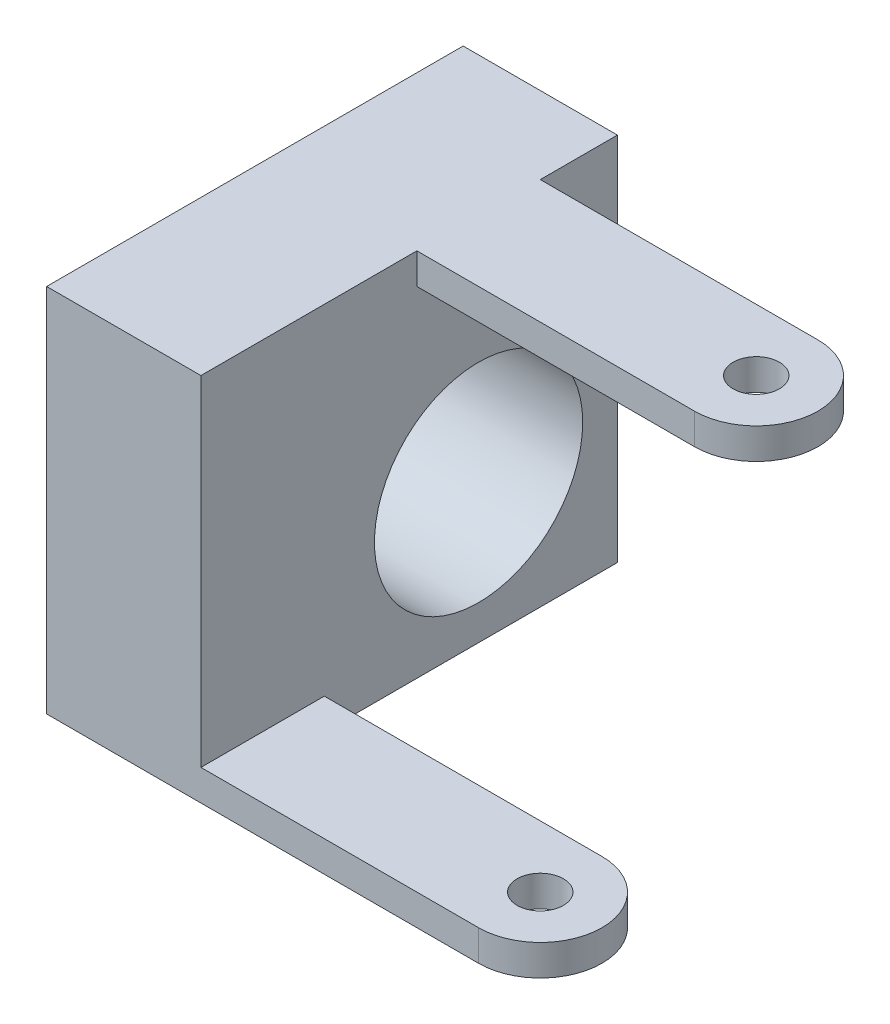
ISO-10303-21;
HEADER;
FILE_DESCRIPTION(('STEP AP214'),'2;1');
FILE_NAME('part.step','',(''),(''),'','','');
FILE_SCHEMA(('AUTOMOTIVE_DESIGN { 1 0 10303 214 1 1 1 1 }'));
ENDSEC;
DATA;
#1=APPLICATION_CONTEXT('core data for automotive mechanical design processes');
#2=APPLICATION_PROTOCOL_DEFINITION('international standard','automotive_design',2000,#1);
#3=PRODUCT_CONTEXT('',#1,'mechanical');
#4=PRODUCT('Part','Part','',(#3));
#5=PRODUCT_RELATED_PRODUCT_CATEGORY('part','',(#4));
#6=PRODUCT_DEFINITION_FORMATION('','',#4);
#7=PRODUCT_DEFINITION_CONTEXT('part definition',#1,'design');
#8=PRODUCT_DEFINITION('design','',#6,#7);
#9=PRODUCT_DEFINITION_SHAPE('','',#8);
#10=(LENGTH_UNIT() NAMED_UNIT(*) SI_UNIT(.MILLI.,.METRE.));
#11=(NAMED_UNIT(*) PLANE_ANGLE_UNIT() SI_UNIT($,.RADIAN.));
#12=(NAMED_UNIT(*) SI_UNIT($,.STERADIAN.) SOLID_ANGLE_UNIT());
#13=UNCERTAINTY_MEASURE_WITH_UNIT(LENGTH_MEASURE(1.E-05),#10,'distance_accuracy_value','');
#14=(GEOMETRIC_REPRESENTATION_CONTEXT(3) GLOBAL_UNCERTAINTY_ASSIGNED_CONTEXT((#13)) GLOBAL_UNIT_ASSIGNED_CONTEXT((#10,
#11,#12)) REPRESENTATION_CONTEXT('',''));
#15=CARTESIAN_POINT('',(0.,0.,0.));
#16=DIRECTION('',(0.,0.,1.));
#17=DIRECTION('',(1.,0.,0.));
#18=AXIS2_PLACEMENT_3D('',#15,#16,#17);
#19=CARTESIAN_POINT('',(23.,0.,14.));
#20=DIRECTION('',(0.,-1.,0.));
#21=DIRECTION('',(0.,0.,-1.));
#22=AXIS2_PLACEMENT_3D('',#19,#20,#21);
#23=CYLINDRICAL_SURFACE('',#22,4.);
#24=DIRECTION('',(0.,-1.,0.));
#25=VECTOR('',#24,1.);
#26=CARTESIAN_POINT('',(23.,24.,18.));
#27=LINE('',#26,#25);
#28=CARTESIAN_POINT('',(23.,0.,18.));
#29=VERTEX_POINT('',#28);
#30=CARTESIAN_POINT('',(23.,2.,18.));
#31=VERTEX_POINT('',#30);
#32=EDGE_CURVE('E261',#29,#31,#27,.F.);
#33=ORIENTED_EDGE('',*,*,#32,.F.);
#34=CARTESIAN_POINT('',(23.,0.,14.));
#35=DIRECTION('',(0.,-1.,0.));
#36=DIRECTION('',(0.,0.,-1.));
#37=AXIS2_PLACEMENT_3D('',#34,#35,#36);
#38=CIRCLE('',#37,4.);
#39=CARTESIAN_POINT('',(23.,0.,9.99999999999999));
#40=VERTEX_POINT('',#39);
#41=EDGE_CURVE('E56',#40,#29,#38,.T.);
#42=ORIENTED_EDGE('',*,*,#41,.F.);
#43=DIRECTION('',(0.,-1.,0.));
#44=VECTOR('',#43,1.);
#45=CARTESIAN_POINT('',(23.,0.,9.99999999999999));
#46=LINE('',#45,#44);
#47=CARTESIAN_POINT('',(23.,2.,9.99999999999999));
#48=VERTEX_POINT('',#47);
#49=EDGE_CURVE('E134',#48,#40,#46,.T.);
#50=ORIENTED_EDGE('',*,*,#49,.F.);
#51=CARTESIAN_POINT('',(23.,2.,14.));
#52=DIRECTION('',(0.,-1.,0.));
#53=DIRECTION('',(0.,0.,-1.));
#54=AXIS2_PLACEMENT_3D('',#51,#52,#53);
#55=CIRCLE('',#54,4.);
#56=EDGE_CURVE('E11',#31,#48,#55,.F.);
#57=ORIENTED_EDGE('',*,*,#56,.F.);
#58=EDGE_LOOP('',(#33,#42,#50,#57));
#59=FACE_BOUND('',#58,.T.);
#60=ADVANCED_FACE('F47',(#59),#23,.T.);
#61=CARTESIAN_POINT('',(5.,24.,18.));
#62=DIRECTION('',(-1.,0.,0.));
#63=DIRECTION('',(0.,0.,1.));
#64=AXIS2_PLACEMENT_3D('',#61,#62,#63);
#65=PLANE('',#64);
#66=CARTESIAN_POINT('',(5.,9.,0.));
#67=DIRECTION('',(1.,0.,0.));
#68=DIRECTION('',(0.,0.,-1.));
#69=AXIS2_PLACEMENT_3D('',#66,#67,#68);
#70=CIRCLE('',#69,6.75);
#71=CARTESIAN_POINT('',(5.,9.,-6.75));
#72=VERTEX_POINT('',#71);
#73=EDGE_CURVE('E203',#72,#72,#70,.T.);
#74=ORIENTED_EDGE('',*,*,#73,.F.);
#75=EDGE_LOOP('',(#74));
#76=FACE_BOUND('',#75,.T.);
#77=DIRECTION('',(0.,1.,0.));
#78=VECTOR('',#77,1.);
#79=CARTESIAN_POINT('',(5.,0.,10.));
#80=LINE('',#79,#78);
#81=CARTESIAN_POINT('',(5.,0.,10.));
#82=VERTEX_POINT('',#81);
#83=CARTESIAN_POINT('',(5.,2.,9.99999999999999));
#84=VERTEX_POINT('',#83);
#85=EDGE_CURVE('E133',#82,#84,#80,.T.);
#86=ORIENTED_EDGE('',*,*,#85,.F.);
#87=DIRECTION('',(0.,0.,-1.));
#88=VECTOR('',#87,1.);
#89=CARTESIAN_POINT('',(5.,0.,18.));
#90=LINE('',#89,#88);
#91=CARTESIAN_POINT('',(5.,0.,-9.));
#92=VERTEX_POINT('',#91);
#93=EDGE_CURVE('E141',#82,#92,#90,.T.);
#94=ORIENTED_EDGE('',*,*,#93,.T.);
#95=DIRECTION('',(0.,-1.,0.));
#96=VECTOR('',#95,1.);
#97=CARTESIAN_POINT('',(5.,24.,-9.));
#98=LINE('',#97,#96);
#99=CARTESIAN_POINT('',(5.,24.,-9.));
#100=VERTEX_POINT('',#99);
#101=EDGE_CURVE('E244',#100,#92,#98,.T.);
#102=ORIENTED_EDGE('',*,*,#101,.F.);
#103=DIRECTION('',(0.,0.,-1.));
#104=VECTOR('',#103,1.);
#105=CARTESIAN_POINT('',(5.,24.,18.));
#106=LINE('',#105,#104);
#107=CARTESIAN_POINT('',(5.,24.,-4.));
#108=VERTEX_POINT('',#107);
#109=EDGE_CURVE('E215',#108,#100,#106,.T.);
#110=ORIENTED_EDGE('',*,*,#109,.F.);
#111=DIRECTION('',(0.,1.,0.));
#112=VECTOR('',#111,1.);
#113=CARTESIAN_POINT('',(5.,24.,-4.));
#114=LINE('',#113,#112);
#115=CARTESIAN_POINT('',(5.,22.,-4.));
#116=VERTEX_POINT('',#115);
#117=EDGE_CURVE('E187',#116,#108,#114,.T.);
#118=ORIENTED_EDGE('',*,*,#117,.F.);
#119=DIRECTION('',(0.,0.,-1.));
#120=VECTOR('',#119,1.);
#121=CARTESIAN_POINT('',(5.,22.,4.));
#122=LINE('',#121,#120);
#123=CARTESIAN_POINT('',(5.,22.,4.));
#124=VERTEX_POINT('',#123);
#125=EDGE_CURVE('E183',#124,#116,#122,.T.);
#126=ORIENTED_EDGE('',*,*,#125,.F.);
#127=DIRECTION('',(0.,-1.,0.));
#128=VECTOR('',#127,1.);
#129=CARTESIAN_POINT('',(5.,24.,4.));
#130=LINE('',#129,#128);
#131=CARTESIAN_POINT('',(5.,24.,4.));
#132=VERTEX_POINT('',#131);
#133=EDGE_CURVE('E179',#132,#124,#130,.T.);
#134=ORIENTED_EDGE('',*,*,#133,.F.);
#135=CARTESIAN_POINT('',(5.,24.,18.));
#136=VERTEX_POINT('',#135);
#137=EDGE_CURVE('E210',#136,#132,#106,.T.);
#138=ORIENTED_EDGE('',*,*,#137,.F.);
#139=DIRECTION('',(0.,-1.,0.));
#140=VECTOR('',#139,1.);
#141=CARTESIAN_POINT('',(5.,24.,18.));
#142=LINE('',#141,#140);
#143=CARTESIAN_POINT('',(5.,2.,18.));
#144=VERTEX_POINT('',#143);
#145=EDGE_CURVE('E223',#136,#144,#142,.T.);
#146=ORIENTED_EDGE('',*,*,#145,.T.);
#147=DIRECTION('',(0.,0.,1.));
#148=VECTOR('',#147,1.);
#149=CARTESIAN_POINT('',(5.,2.,18.));
#150=LINE('',#149,#148);
#151=EDGE_CURVE('E155',#84,#144,#150,.T.);
#152=ORIENTED_EDGE('',*,*,#151,.F.);
#153=EDGE_LOOP('',(#86,#94,#102,#110,#118,#126,#134,#138,#146,#152));
#154=FACE_BOUND('',#153,.T.);
#155=ADVANCED_FACE('F152',(#76,#154),#65,.F.);
#156=CARTESIAN_POINT('',(23.,22.,0.));
#157=DIRECTION('',(0.,-1.,0.));
#158=DIRECTION('',(0.,0.,-1.));
#159=AXIS2_PLACEMENT_3D('',#156,#157,#158);
#160=CYLINDRICAL_SURFACE('',#159,4.);
#161=DIRECTION('',(0.,1.,0.));
#162=VECTOR('',#161,1.);
#163=CARTESIAN_POINT('',(23.,22.,4.));
#164=LINE('',#163,#162);
#165=CARTESIAN_POINT('',(23.,22.,4.));
#166=VERTEX_POINT('',#165);
#167=CARTESIAN_POINT('',(23.,24.,4.));
#168=VERTEX_POINT('',#167);
#169=EDGE_CURVE('E247',#166,#168,#164,.T.);
#170=ORIENTED_EDGE('',*,*,#169,.F.);
#171=CARTESIAN_POINT('',(23.,22.,0.));
#172=DIRECTION('',(0.,1.,0.));
#173=DIRECTION('',(0.,0.,1.));
#174=AXIS2_PLACEMENT_3D('',#171,#172,#173);
#175=CIRCLE('',#174,4.);
#176=CARTESIAN_POINT('',(23.,22.,-4.));
#177=VERTEX_POINT('',#176);
#178=EDGE_CURVE('E255',#177,#166,#175,.F.);
#179=ORIENTED_EDGE('',*,*,#178,.F.);
#180=DIRECTION('',(0.,1.,0.));
#181=VECTOR('',#180,1.);
#182=CARTESIAN_POINT('',(23.,22.,-4.));
#183=LINE('',#182,#181);
#184=CARTESIAN_POINT('',(23.,24.,-4.));
#185=VERTEX_POINT('',#184);
#186=EDGE_CURVE('E251',#185,#177,#183,.F.);
#187=ORIENTED_EDGE('',*,*,#186,.F.);
#188=CARTESIAN_POINT('',(23.,24.,0.));
#189=DIRECTION('',(0.,-1.,0.));
#190=DIRECTION('',(0.,0.,-1.));
#191=AXIS2_PLACEMENT_3D('',#188,#189,#190);
#192=CIRCLE('',#191,4.);
#193=EDGE_CURVE('E258',#168,#185,#192,.F.);
#194=ORIENTED_EDGE('',*,*,#193,.F.);
#195=EDGE_LOOP('',(#170,#179,#187,#194));
#196=FACE_BOUND('',#195,.T.);
#197=ADVANCED_FACE('F320',(#196),#160,.T.);
#198=CARTESIAN_POINT('',(-5.,24.,-9.));
#199=DIRECTION('',(0.,0.,1.));
#200=DIRECTION('',(1.,0.,0.));
#201=AXIS2_PLACEMENT_3D('',#198,#199,#200);
#202=PLANE('',#201);
#203=DIRECTION('',(-1.,0.,0.));
#204=VECTOR('',#203,1.);
#205=CARTESIAN_POINT('',(-5.,0.,-9.));
#206=LINE('',#205,#204);
#207=CARTESIAN_POINT('',(-5.,0.,-9.));
#208=VERTEX_POINT('',#207);
#209=EDGE_CURVE('E144',#92,#208,#206,.T.);
#210=ORIENTED_EDGE('',*,*,#209,.T.);
#211=DIRECTION('',(0.,-1.,0.));
#212=VECTOR('',#211,1.);
#213=CARTESIAN_POINT('',(-5.,24.,-9.));
#214=LINE('',#213,#212);
#215=CARTESIAN_POINT('',(-5.,24.,-9.));
#216=VERTEX_POINT('',#215);
#217=EDGE_CURVE('E240',#216,#208,#214,.T.);
#218=ORIENTED_EDGE('',*,*,#217,.F.);
#219=DIRECTION('',(-1.,0.,0.));
#220=VECTOR('',#219,1.);
#221=CARTESIAN_POINT('',(-5.,24.,-9.));
#222=LINE('',#221,#220);
#223=EDGE_CURVE('E214',#100,#216,#222,.T.);
#224=ORIENTED_EDGE('',*,*,#223,.F.);
#225=ORIENTED_EDGE('',*,*,#101,.T.);
#226=EDGE_LOOP('',(#210,#218,#224,#225));
#227=FACE_BOUND('',#226,.T.);
#228=ADVANCED_FACE('F279',(#227),#202,.F.);
#229=CARTESIAN_POINT('',(-4.99999999999999,24.,18.));
#230=DIRECTION('',(1.,0.,0.));
#231=DIRECTION('',(0.,0.,-1.));
#232=AXIS2_PLACEMENT_3D('',#229,#230,#231);
#233=PLANE('',#232);
#234=CARTESIAN_POINT('',(-5.,9.,0.));
#235=DIRECTION('',(1.,0.,0.));
#236=DIRECTION('',(0.,0.,-1.));
#237=AXIS2_PLACEMENT_3D('',#234,#235,#236);
#238=CIRCLE('',#237,6.75);
#239=CARTESIAN_POINT('',(-5.,9.,-6.75));
#240=VERTEX_POINT('',#239);
#241=EDGE_CURVE('E149',#240,#240,#238,.F.);
#242=ORIENTED_EDGE('',*,*,#241,.F.);
#243=EDGE_LOOP('',(#242));
#244=FACE_BOUND('',#243,.T.);
#245=DIRECTION('',(0.,0.,1.));
#246=VECTOR('',#245,1.);
#247=CARTESIAN_POINT('',(-4.99999999999999,0.,18.));
#248=LINE('',#247,#246);
#249=CARTESIAN_POINT('',(-4.99999999999999,0.,18.));
#250=VERTEX_POINT('',#249);
#251=EDGE_CURVE('E227',#208,#250,#248,.T.);
#252=ORIENTED_EDGE('',*,*,#251,.T.);
#253=DIRECTION('',(0.,-1.,0.));
#254=VECTOR('',#253,1.);
#255=CARTESIAN_POINT('',(-4.99999999999999,24.,18.));
#256=LINE('',#255,#254);
#257=CARTESIAN_POINT('',(-4.99999999999999,24.,18.));
#258=VERTEX_POINT('',#257);
#259=EDGE_CURVE('E236',#258,#250,#256,.T.);
#260=ORIENTED_EDGE('',*,*,#259,.F.);
#261=DIRECTION('',(0.,0.,1.));
#262=VECTOR('',#261,1.);
#263=CARTESIAN_POINT('',(-4.99999999999999,24.,18.));
#264=LINE('',#263,#262);
#265=EDGE_CURVE('E218',#216,#258,#264,.T.);
#266=ORIENTED_EDGE('',*,*,#265,.F.);
#267=ORIENTED_EDGE('',*,*,#217,.T.);
#268=EDGE_LOOP('',(#252,#260,#266,#267));
#269=FACE_BOUND('',#268,.T.);
#270=ADVANCED_FACE('F275',(#244,#269),#233,.F.);
#271=CARTESIAN_POINT('',(-4.99999999999999,24.,18.));
#272=DIRECTION('',(0.,0.,-1.));
#273=DIRECTION('',(-1.,0.,0.));
#274=AXIS2_PLACEMENT_3D('',#271,#272,#273);
#275=PLANE('',#274);
#276=DIRECTION('',(1.,0.,0.));
#277=VECTOR('',#276,1.);
#278=CARTESIAN_POINT('',(-4.99999999999999,0.,18.));
#279=LINE('',#278,#277);
#280=EDGE_CURVE('E230',#250,#29,#279,.T.);
#281=ORIENTED_EDGE('',*,*,#280,.T.);
#282=ORIENTED_EDGE('',*,*,#32,.T.);
#283=DIRECTION('',(-1.,0.,0.));
#284=VECTOR('',#283,1.);
#285=CARTESIAN_POINT('',(27.,2.,18.));
#286=LINE('',#285,#284);
#287=EDGE_CURVE('E161',#31,#144,#286,.T.);
#288=ORIENTED_EDGE('',*,*,#287,.T.);
#289=ORIENTED_EDGE('',*,*,#145,.F.);
#290=DIRECTION('',(1.,0.,0.));
#291=VECTOR('',#290,1.);
#292=CARTESIAN_POINT('',(-4.99999999999999,24.,18.));
#293=LINE('',#292,#291);
#294=EDGE_CURVE('E221',#258,#136,#293,.T.);
#295=ORIENTED_EDGE('',*,*,#294,.F.);
#296=ORIENTED_EDGE('',*,*,#259,.T.);
#297=EDGE_LOOP('',(#281,#282,#288,#289,#295,#296));
#298=FACE_BOUND('',#297,.T.);
#299=ADVANCED_FACE('F269',(#298),#275,.F.);
#300=CARTESIAN_POINT('',(0.,24.,0.));
#301=DIRECTION('',(0.,-1.,0.));
#302=DIRECTION('',(0.,0.,-1.));
#303=AXIS2_PLACEMENT_3D('',#300,#301,#302);
#304=PLANE('',#303);
#305=CARTESIAN_POINT('',(23.,24.,0.));
#306=DIRECTION('',(0.,1.,0.));
#307=DIRECTION('',(0.,0.,1.));
#308=AXIS2_PLACEMENT_3D('',#305,#306,#307);
#309=CIRCLE('',#308,1.5);
#310=CARTESIAN_POINT('',(23.,24.,1.5));
#311=VERTEX_POINT('',#310);
#312=EDGE_CURVE('E137',#311,#311,#309,.T.);
#313=ORIENTED_EDGE('',*,*,#312,.F.);
#314=EDGE_LOOP('',(#313));
#315=FACE_BOUND('',#314,.T.);
#316=DIRECTION('',(-1.,0.,0.));
#317=VECTOR('',#316,1.);
#318=CARTESIAN_POINT('',(27.,24.,4.));
#319=LINE('',#318,#317);
#320=EDGE_CURVE('E191',#168,#132,#319,.T.);
#321=ORIENTED_EDGE('',*,*,#320,.F.);
#322=ORIENTED_EDGE('',*,*,#193,.T.);
#323=DIRECTION('',(-1.,0.,0.));
#324=VECTOR('',#323,1.);
#325=CARTESIAN_POINT('',(27.,24.,-4.));
#326=LINE('',#325,#324);
#327=EDGE_CURVE('E194',#185,#108,#326,.T.);
#328=ORIENTED_EDGE('',*,*,#327,.T.);
#329=ORIENTED_EDGE('',*,*,#109,.T.);
#330=ORIENTED_EDGE('',*,*,#223,.T.);
#331=ORIENTED_EDGE('',*,*,#265,.T.);
#332=ORIENTED_EDGE('',*,*,#294,.T.);
#333=ORIENTED_EDGE('',*,*,#137,.T.);
#334=EDGE_LOOP('',(#321,#322,#328,#329,#330,#331,#332,#333));
#335=FACE_BOUND('',#334,.T.);
#336=ADVANCED_FACE('F299',(#315,#335),#304,.F.);
#337=CARTESIAN_POINT('',(0.,0.,0.));
#338=DIRECTION('',(0.,-1.,0.));
#339=DIRECTION('',(0.,0.,-1.));
#340=AXIS2_PLACEMENT_3D('',#337,#338,#339);
#341=PLANE('',#340);
#342=CARTESIAN_POINT('',(23.,0.,14.));
#343=DIRECTION('',(0.,-1.,0.));
#344=DIRECTION('',(0.,0.,-1.));
#345=AXIS2_PLACEMENT_3D('',#342,#343,#344);
#346=CIRCLE('',#345,1.5);
#347=CARTESIAN_POINT('',(23.,0.,12.5));
#348=VERTEX_POINT('',#347);
#349=EDGE_CURVE('E157',#348,#348,#346,.F.);
#350=ORIENTED_EDGE('',*,*,#349,.T.);
#351=EDGE_LOOP('',(#350));
#352=FACE_BOUND('',#351,.T.);
#353=DIRECTION('',(-1.,0.,0.));
#354=VECTOR('',#353,1.);
#355=CARTESIAN_POINT('',(27.,0.,9.99999999999999));
#356=LINE('',#355,#354);
#357=EDGE_CURVE('E128',#40,#82,#356,.T.);
#358=ORIENTED_EDGE('',*,*,#357,.F.);
#359=ORIENTED_EDGE('',*,*,#41,.T.);
#360=ORIENTED_EDGE('',*,*,#280,.F.);
#361=ORIENTED_EDGE('',*,*,#251,.F.);
#362=ORIENTED_EDGE('',*,*,#209,.F.);
#363=ORIENTED_EDGE('',*,*,#93,.F.);
#364=EDGE_LOOP('',(#358,#359,#360,#361,#362,#363));
#365=FACE_BOUND('',#364,.T.);
#366=ADVANCED_FACE('F142',(#352,#365),#341,.T.);
#367=CARTESIAN_POINT('',(-24.0918830920368,9.,0.));
#368=DIRECTION('',(1.,0.,0.));
#369=DIRECTION('',(0.,0.,-1.));
#370=AXIS2_PLACEMENT_3D('',#367,#368,#369);
#371=CYLINDRICAL_SURFACE('',#370,6.75);
#372=ORIENTED_EDGE('',*,*,#241,.T.);
#373=EDGE_LOOP('',(#372));
#374=FACE_BOUND('',#373,.T.);
#375=ORIENTED_EDGE('',*,*,#73,.T.);
#376=EDGE_LOOP('',(#375));
#377=FACE_BOUND('',#376,.T.);
#378=ADVANCED_FACE('F342',(#374,#377),#371,.F.);
#379=CARTESIAN_POINT('',(27.,24.,4.));
#380=DIRECTION('',(0.,0.,-1.));
#381=DIRECTION('',(0.,1.,0.));
#382=AXIS2_PLACEMENT_3D('',#379,#380,#381);
#383=PLANE('',#382);
#384=DIRECTION('',(-1.,0.,0.));
#385=VECTOR('',#384,1.);
#386=CARTESIAN_POINT('',(27.,22.,4.));
#387=LINE('',#386,#385);
#388=EDGE_CURVE('E200',#166,#124,#387,.T.);
#389=ORIENTED_EDGE('',*,*,#388,.F.);
#390=ORIENTED_EDGE('',*,*,#169,.T.);
#391=ORIENTED_EDGE('',*,*,#320,.T.);
#392=ORIENTED_EDGE('',*,*,#133,.T.);
#393=EDGE_LOOP('',(#389,#390,#391,#392));
#394=FACE_BOUND('',#393,.T.);
#395=ADVANCED_FACE('F297',(#394),#383,.F.);
#396=CARTESIAN_POINT('',(27.,22.,4.));
#397=DIRECTION('',(0.,1.,0.));
#398=DIRECTION('',(0.,0.,1.));
#399=AXIS2_PLACEMENT_3D('',#396,#397,#398);
#400=PLANE('',#399);
#401=CARTESIAN_POINT('',(23.,22.,0.));
#402=DIRECTION('',(0.,1.,0.));
#403=DIRECTION('',(0.,0.,1.));
#404=AXIS2_PLACEMENT_3D('',#401,#402,#403);
#405=CIRCLE('',#404,1.5);
#406=CARTESIAN_POINT('',(23.,22.,1.5));
#407=VERTEX_POINT('',#406);
#408=EDGE_CURVE('E175',#407,#407,#405,.F.);
#409=ORIENTED_EDGE('',*,*,#408,.F.);
#410=EDGE_LOOP('',(#409));
#411=FACE_BOUND('',#410,.T.);
#412=DIRECTION('',(-1.,0.,0.));
#413=VECTOR('',#412,1.);
#414=CARTESIAN_POINT('',(27.,22.,-4.));
#415=LINE('',#414,#413);
#416=EDGE_CURVE('E197',#177,#116,#415,.T.);
#417=ORIENTED_EDGE('',*,*,#416,.F.);
#418=ORIENTED_EDGE('',*,*,#178,.T.);
#419=ORIENTED_EDGE('',*,*,#388,.T.);
#420=ORIENTED_EDGE('',*,*,#125,.T.);
#421=EDGE_LOOP('',(#417,#418,#419,#420));
#422=FACE_BOUND('',#421,.T.);
#423=ADVANCED_FACE('F291',(#411,#422),#400,.F.);
#424=CARTESIAN_POINT('',(27.,24.,-4.));
#425=DIRECTION('',(0.,0.,1.));
#426=DIRECTION('',(0.,-1.,0.));
#427=AXIS2_PLACEMENT_3D('',#424,#425,#426);
#428=PLANE('',#427);
#429=ORIENTED_EDGE('',*,*,#327,.F.);
#430=ORIENTED_EDGE('',*,*,#186,.T.);
#431=ORIENTED_EDGE('',*,*,#416,.T.);
#432=ORIENTED_EDGE('',*,*,#117,.T.);
#433=EDGE_LOOP('',(#429,#430,#431,#432));
#434=FACE_BOUND('',#433,.T.);
#435=ADVANCED_FACE('F287',(#434),#428,.F.);
#436=CARTESIAN_POINT('',(23.,17.7573593128807,0.));
#437=DIRECTION('',(0.,1.,0.));
#438=DIRECTION('',(0.,0.,1.));
#439=AXIS2_PLACEMENT_3D('',#436,#437,#438);
#440=CYLINDRICAL_SURFACE('',#439,1.5);
#441=ORIENTED_EDGE('',*,*,#408,.T.);
#442=EDGE_LOOP('',(#441));
#443=FACE_BOUND('',#442,.T.);
#444=ORIENTED_EDGE('',*,*,#312,.T.);
#445=EDGE_LOOP('',(#444));
#446=FACE_BOUND('',#445,.T.);
#447=ADVANCED_FACE('F312',(#443,#446),#440,.F.);
#448=CARTESIAN_POINT('',(27.,0.,9.99999999999999));
#449=DIRECTION('',(0.,0.,1.));
#450=DIRECTION('',(1.,0.,0.));
#451=AXIS2_PLACEMENT_3D('',#448,#449,#450);
#452=PLANE('',#451);
#453=DIRECTION('',(-1.,0.,0.));
#454=VECTOR('',#453,1.);
#455=CARTESIAN_POINT('',(27.,2.,9.99999999999999));
#456=LINE('',#455,#454);
#457=EDGE_CURVE('E138',#48,#84,#456,.T.);
#458=ORIENTED_EDGE('',*,*,#457,.F.);
#459=ORIENTED_EDGE('',*,*,#49,.T.);
#460=ORIENTED_EDGE('',*,*,#357,.T.);
#461=ORIENTED_EDGE('',*,*,#85,.T.);
#462=EDGE_LOOP('',(#458,#459,#460,#461));
#463=FACE_BOUND('',#462,.T.);
#464=ADVANCED_FACE('F131',(#463),#452,.F.);
#465=CARTESIAN_POINT('',(27.,2.,18.));
#466=DIRECTION('',(0.,-1.,0.));
#467=DIRECTION('',(0.,0.,-1.));
#468=AXIS2_PLACEMENT_3D('',#465,#466,#467);
#469=PLANE('',#468);
#470=CARTESIAN_POINT('',(23.,2.,14.));
#471=DIRECTION('',(0.,1.,0.));
#472=DIRECTION('',(0.,0.,1.));
#473=AXIS2_PLACEMENT_3D('',#470,#471,#472);
#474=CIRCLE('',#473,1.5);
#475=CARTESIAN_POINT('',(23.,2.,15.5));
#476=VERTEX_POINT('',#475);
#477=EDGE_CURVE('E164',#476,#476,#474,.T.);
#478=ORIENTED_EDGE('',*,*,#477,.F.);
#479=EDGE_LOOP('',(#478));
#480=FACE_BOUND('',#479,.T.);
#481=ORIENTED_EDGE('',*,*,#287,.F.);
#482=ORIENTED_EDGE('',*,*,#56,.T.);
#483=ORIENTED_EDGE('',*,*,#457,.T.);
#484=ORIENTED_EDGE('',*,*,#151,.T.);
#485=EDGE_LOOP('',(#481,#482,#483,#484));
#486=FACE_BOUND('',#485,.T.);
#487=ADVANCED_FACE('F300',(#480,#486),#469,.F.);
#488=CARTESIAN_POINT('',(23.,-4.24264068711929,14.));
#489=DIRECTION('',(0.,1.,0.));
#490=DIRECTION('',(0.,0.,1.));
#491=AXIS2_PLACEMENT_3D('',#488,#489,#490);
#492=CYLINDRICAL_SURFACE('',#491,1.5);
#493=ORIENTED_EDGE('',*,*,#477,.T.);
#494=EDGE_LOOP('',(#493));
#495=FACE_BOUND('',#494,.T.);
#496=ORIENTED_EDGE('',*,*,#349,.F.);
#497=EDGE_LOOP('',(#496));
#498=FACE_BOUND('',#497,.T.);
#499=ADVANCED_FACE('F302',(#495,#498),#492,.F.);
#500=CLOSED_SHELL('',(#60,#155,#197,#228,#270,#299,#336,#366,#378,#395,#423,#435,#447,#464,#487,#499));
#501=MANIFOLD_SOLID_BREP('B2',#500);
#502=ADVANCED_BREP_SHAPE_REPRESENTATION('',(#18,#501),#14);
#503=SHAPE_DEFINITION_REPRESENTATION(#9,#502);
ENDSEC;
END-ISO-10303-21;
